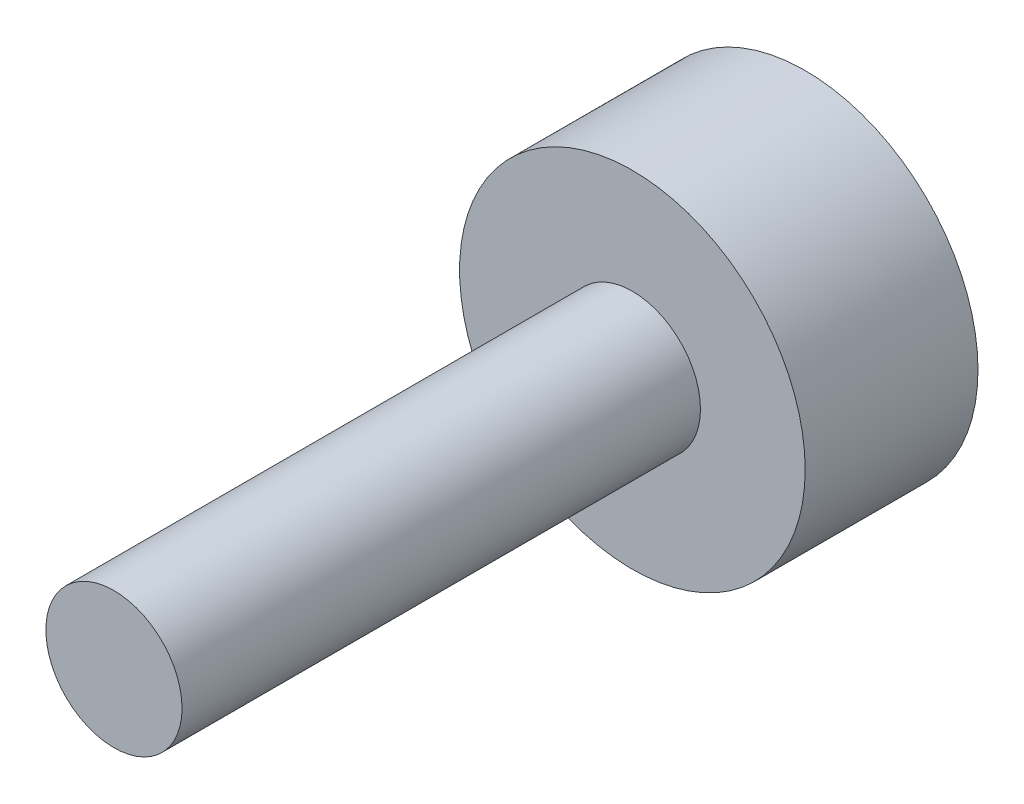
ISO-10303-21;
HEADER;
FILE_DESCRIPTION(('STEP AP214'),'2;1');
FILE_NAME('part.step','',(''),(''),'','','');
FILE_SCHEMA(('AUTOMOTIVE_DESIGN { 1 0 10303 214 1 1 1 1 }'));
ENDSEC;
DATA;
#1=APPLICATION_CONTEXT('core data for automotive mechanical design processes');
#2=APPLICATION_PROTOCOL_DEFINITION('international standard','automotive_design',2000,#1);
#3=PRODUCT_CONTEXT('',#1,'mechanical');
#4=PRODUCT('Part','Part','',(#3));
#5=PRODUCT_RELATED_PRODUCT_CATEGORY('part','',(#4));
#6=PRODUCT_DEFINITION_FORMATION('','',#4);
#7=PRODUCT_DEFINITION_CONTEXT('part definition',#1,'design');
#8=PRODUCT_DEFINITION('design','',#6,#7);
#9=PRODUCT_DEFINITION_SHAPE('','',#8);
#10=(LENGTH_UNIT() NAMED_UNIT(*) SI_UNIT(.MILLI.,.METRE.));
#11=(NAMED_UNIT(*) PLANE_ANGLE_UNIT() SI_UNIT($,.RADIAN.));
#12=(NAMED_UNIT(*) SI_UNIT($,.STERADIAN.) SOLID_ANGLE_UNIT());
#13=UNCERTAINTY_MEASURE_WITH_UNIT(LENGTH_MEASURE(1.E-05),#10,'distance_accuracy_value','');
#14=(GEOMETRIC_REPRESENTATION_CONTEXT(3) GLOBAL_UNCERTAINTY_ASSIGNED_CONTEXT((#13)) GLOBAL_UNIT_ASSIGNED_CONTEXT((#10,
#11,#12)) REPRESENTATION_CONTEXT('',''));
#15=CARTESIAN_POINT('',(0.,0.,0.));
#16=DIRECTION('',(0.,0.,1.));
#17=DIRECTION('',(1.,0.,0.));
#18=AXIS2_PLACEMENT_3D('',#15,#16,#17);
#19=CARTESIAN_POINT('',(0.,0.,2.5));
#20=DIRECTION('',(0.,0.,-1.));
#21=DIRECTION('',(-1.,0.,0.));
#22=AXIS2_PLACEMENT_3D('',#19,#20,#21);
#23=CYLINDRICAL_SURFACE('',#22,5.);
#24=CARTESIAN_POINT('',(0.,0.,2.5));
#25=DIRECTION('',(0.,0.,1.));
#26=DIRECTION('',(1.,0.,0.));
#27=AXIS2_PLACEMENT_3D('',#24,#25,#26);
#28=CIRCLE('',#27,5.);
#29=CARTESIAN_POINT('',(5.,0.,2.5));
#30=VERTEX_POINT('',#29);
#31=EDGE_CURVE('E38',#30,#30,#28,.T.);
#32=ORIENTED_EDGE('',*,*,#31,.F.);
#33=EDGE_LOOP('',(#32));
#34=FACE_BOUND('',#33,.T.);
#35=CARTESIAN_POINT('',(0.,0.,-2.5));
#36=DIRECTION('',(0.,0.,1.));
#37=DIRECTION('',(1.,0.,0.));
#38=AXIS2_PLACEMENT_3D('',#35,#36,#37);
#39=CIRCLE('',#38,5.);
#40=CARTESIAN_POINT('',(5.,0.,-2.5));
#41=VERTEX_POINT('',#40);
#42=EDGE_CURVE('E34',#41,#41,#39,.T.);
#43=ORIENTED_EDGE('',*,*,#42,.T.);
#44=EDGE_LOOP('',(#43));
#45=FACE_BOUND('',#44,.T.);
#46=ADVANCED_FACE('F31',(#34,#45),#23,.T.);
#47=CARTESIAN_POINT('',(0.,0.,2.5));
#48=DIRECTION('',(0.,0.,1.));
#49=DIRECTION('',(1.,0.,0.));
#50=AXIS2_PLACEMENT_3D('',#47,#48,#49);
#51=PLANE('',#50);
#52=CARTESIAN_POINT('',(0.,0.,2.5));
#53=DIRECTION('',(0.,0.,1.));
#54=DIRECTION('',(1.,0.,0.));
#55=AXIS2_PLACEMENT_3D('',#52,#53,#54);
#56=CIRCLE('',#55,1.97);
#57=CARTESIAN_POINT('',(1.97,0.,2.5));
#58=VERTEX_POINT('',#57);
#59=EDGE_CURVE('E10',#58,#58,#56,.T.);
#60=ORIENTED_EDGE('',*,*,#59,.F.);
#61=EDGE_LOOP('',(#60));
#62=FACE_BOUND('',#61,.T.);
#63=ORIENTED_EDGE('',*,*,#31,.T.);
#64=EDGE_LOOP('',(#63));
#65=FACE_BOUND('',#64,.T.);
#66=ADVANCED_FACE('F55',(#62,#65),#51,.T.);
#67=CARTESIAN_POINT('',(0.,0.,-2.5));
#68=DIRECTION('',(0.,0.,1.));
#69=DIRECTION('',(1.,0.,0.));
#70=AXIS2_PLACEMENT_3D('',#67,#68,#69);
#71=PLANE('',#70);
#72=ORIENTED_EDGE('',*,*,#42,.F.);
#73=EDGE_LOOP('',(#72));
#74=FACE_BOUND('',#73,.T.);
#75=ADVANCED_FACE('F52',(#74),#71,.F.);
#76=CARTESIAN_POINT('',(0.,0.,17.5));
#77=DIRECTION('',(0.,0.,-1.));
#78=DIRECTION('',(-1.,0.,0.));
#79=AXIS2_PLACEMENT_3D('',#76,#77,#78);
#80=CYLINDRICAL_SURFACE('',#79,1.97);
#81=CARTESIAN_POINT('',(0.,0.,17.5));
#82=DIRECTION('',(0.,0.,1.));
#83=DIRECTION('',(1.,0.,0.));
#84=AXIS2_PLACEMENT_3D('',#81,#82,#83);
#85=CIRCLE('',#84,1.97);
#86=CARTESIAN_POINT('',(1.97,0.,17.5));
#87=VERTEX_POINT('',#86);
#88=EDGE_CURVE('E44',#87,#87,#85,.T.);
#89=ORIENTED_EDGE('',*,*,#88,.F.);
#90=EDGE_LOOP('',(#89));
#91=FACE_BOUND('',#90,.T.);
#92=ORIENTED_EDGE('',*,*,#59,.T.);
#93=EDGE_LOOP('',(#92));
#94=FACE_BOUND('',#93,.T.);
#95=ADVANCED_FACE('F54',(#91,#94),#80,.T.);
#96=CARTESIAN_POINT('',(0.,0.,17.5));
#97=DIRECTION('',(0.,0.,1.));
#98=DIRECTION('',(1.,0.,0.));
#99=AXIS2_PLACEMENT_3D('',#96,#97,#98);
#100=PLANE('',#99);
#101=ORIENTED_EDGE('',*,*,#88,.T.);
#102=EDGE_LOOP('',(#101));
#103=FACE_BOUND('',#102,.T.);
#104=ADVANCED_FACE('F60',(#103),#100,.T.);
#105=CLOSED_SHELL('',(#46,#66,#75,#95,#104));
#106=MANIFOLD_SOLID_BREP('B2',#105);
#107=ADVANCED_BREP_SHAPE_REPRESENTATION('',(#18,#106),#14);
#108=SHAPE_DEFINITION_REPRESENTATION(#9,#107);
ENDSEC;
END-ISO-10303-21;
